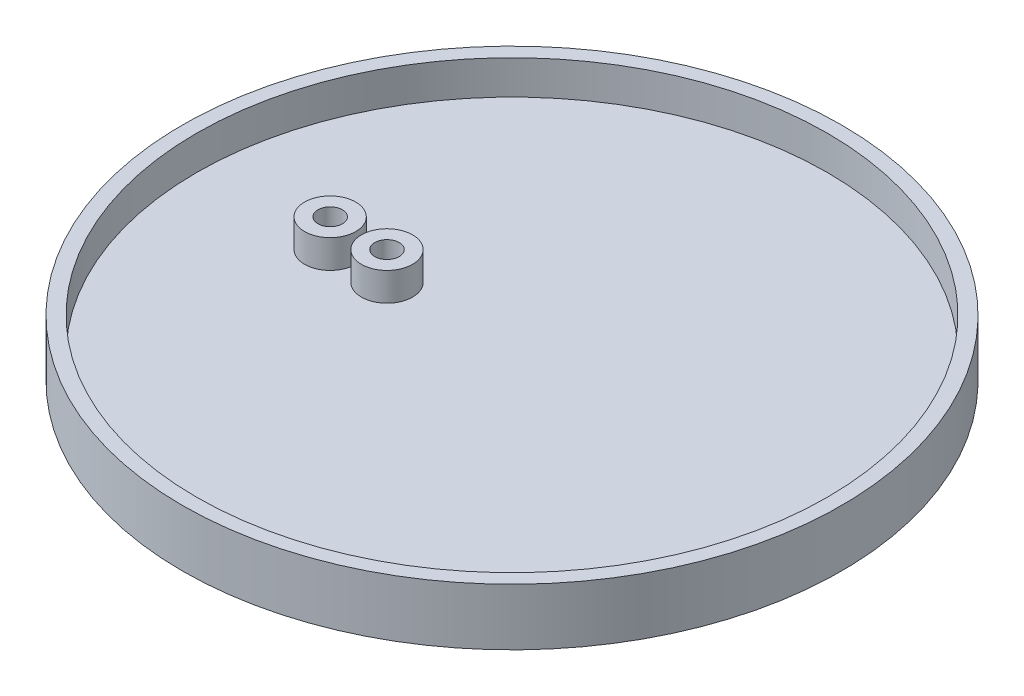
ISO-10303-21;
HEADER;
FILE_DESCRIPTION(('STEP AP214'),'2;1');
FILE_NAME('part.step','',(''),(''),'','','');
FILE_SCHEMA(('AUTOMOTIVE_DESIGN { 1 0 10303 214 1 1 1 1 }'));
ENDSEC;
DATA;
#1=APPLICATION_CONTEXT('core data for automotive mechanical design processes');
#2=APPLICATION_PROTOCOL_DEFINITION('international standard','automotive_design',2000,#1);
#3=PRODUCT_CONTEXT('',#1,'mechanical');
#4=PRODUCT('Part','Part','',(#3));
#5=PRODUCT_RELATED_PRODUCT_CATEGORY('part','',(#4));
#6=PRODUCT_DEFINITION_FORMATION('','',#4);
#7=PRODUCT_DEFINITION_CONTEXT('part definition',#1,'design');
#8=PRODUCT_DEFINITION('design','',#6,#7);
#9=PRODUCT_DEFINITION_SHAPE('','',#8);
#10=(LENGTH_UNIT() NAMED_UNIT(*) SI_UNIT(.MILLI.,.METRE.));
#11=(NAMED_UNIT(*) PLANE_ANGLE_UNIT() SI_UNIT($,.RADIAN.));
#12=(NAMED_UNIT(*) SI_UNIT($,.STERADIAN.) SOLID_ANGLE_UNIT());
#13=UNCERTAINTY_MEASURE_WITH_UNIT(LENGTH_MEASURE(1.E-05),#10,'distance_accuracy_value','');
#14=(GEOMETRIC_REPRESENTATION_CONTEXT(3) GLOBAL_UNCERTAINTY_ASSIGNED_CONTEXT((#13)) GLOBAL_UNIT_ASSIGNED_CONTEXT((#10,
#11,#12)) REPRESENTATION_CONTEXT('',''));
#15=CARTESIAN_POINT('',(0.,0.,0.));
#16=DIRECTION('',(0.,0.,1.));
#17=DIRECTION('',(1.,0.,0.));
#18=AXIS2_PLACEMENT_3D('',#15,#16,#17);
#19=CARTESIAN_POINT('',(0.,4.,0.));
#20=DIRECTION('',(0.,-1.,0.));
#21=DIRECTION('',(0.,0.,-1.));
#22=AXIS2_PLACEMENT_3D('',#19,#20,#21);
#23=CYLINDRICAL_SURFACE('',#22,58.);
#24=CARTESIAN_POINT('',(0.,0.,0.));
#25=DIRECTION('',(0.,1.,0.));
#26=DIRECTION('',(0.,0.,1.));
#27=AXIS2_PLACEMENT_3D('',#24,#25,#26);
#28=CIRCLE('',#27,58.);
#29=CARTESIAN_POINT('',(0.,0.,58.));
#30=VERTEX_POINT('',#29);
#31=EDGE_CURVE('E62',#30,#30,#28,.T.);
#32=ORIENTED_EDGE('',*,*,#31,.T.);
#33=EDGE_LOOP('',(#32));
#34=FACE_BOUND('',#33,.T.);
#35=CARTESIAN_POINT('',(0.,10.,0.));
#36=DIRECTION('',(0.,1.,0.));
#37=DIRECTION('',(0.,0.,1.));
#38=AXIS2_PLACEMENT_3D('',#35,#36,#37);
#39=CIRCLE('',#38,58.);
#40=CARTESIAN_POINT('',(0.,10.,58.));
#41=VERTEX_POINT('',#40);
#42=EDGE_CURVE('E54',#41,#41,#39,.T.);
#43=ORIENTED_EDGE('',*,*,#42,.F.);
#44=EDGE_LOOP('',(#43));
#45=FACE_BOUND('',#44,.T.);
#46=ADVANCED_FACE('F39',(#34,#45),#23,.T.);
#47=CARTESIAN_POINT('',(-22.,0.,0.));
#48=DIRECTION('',(0.,1.,0.));
#49=DIRECTION('',(0.,0.,1.));
#50=AXIS2_PLACEMENT_3D('',#47,#48,#49);
#51=PLANE('',#50);
#52=CARTESIAN_POINT('',(-22.,0.,0.));
#53=DIRECTION('',(0.,1.,0.));
#54=DIRECTION('',(0.,0.,1.));
#55=AXIS2_PLACEMENT_3D('',#52,#53,#54);
#56=CIRCLE('',#55,2.15);
#57=CARTESIAN_POINT('',(-22.,0.,2.15));
#58=VERTEX_POINT('',#57);
#59=EDGE_CURVE('E118',#58,#58,#56,.T.);
#60=ORIENTED_EDGE('',*,*,#59,.T.);
#61=EDGE_LOOP('',(#60));
#62=FACE_BOUND('',#61,.T.);
#63=CARTESIAN_POINT('',(-32.,0.,0.));
#64=DIRECTION('',(0.,1.,0.));
#65=DIRECTION('',(0.,0.,1.));
#66=AXIS2_PLACEMENT_3D('',#63,#64,#65);
#67=CIRCLE('',#66,2.15);
#68=CARTESIAN_POINT('',(-32.,0.,2.15));
#69=VERTEX_POINT('',#68);
#70=EDGE_CURVE('E124',#69,#69,#67,.T.);
#71=ORIENTED_EDGE('',*,*,#70,.T.);
#72=EDGE_LOOP('',(#71));
#73=FACE_BOUND('',#72,.T.);
#74=ORIENTED_EDGE('',*,*,#31,.F.);
#75=EDGE_LOOP('',(#74));
#76=FACE_BOUND('',#75,.T.);
#77=ADVANCED_FACE('F102',(#62,#73,#76),#51,.F.);
#78=CARTESIAN_POINT('',(0.,10.,0.));
#79=DIRECTION('',(0.,1.,0.));
#80=DIRECTION('',(0.,0.,1.));
#81=AXIS2_PLACEMENT_3D('',#78,#79,#80);
#82=PLANE('',#81);
#83=ORIENTED_EDGE('',*,*,#42,.T.);
#84=EDGE_LOOP('',(#83));
#85=FACE_BOUND('',#84,.T.);
#86=CARTESIAN_POINT('',(0.,10.,0.));
#87=DIRECTION('',(0.,1.,0.));
#88=DIRECTION('',(0.,0.,1.));
#89=AXIS2_PLACEMENT_3D('',#86,#87,#88);
#90=CIRCLE('',#89,55.5);
#91=CARTESIAN_POINT('',(0.,10.,55.5));
#92=VERTEX_POINT('',#91);
#93=EDGE_CURVE('E112',#92,#92,#90,.T.);
#94=ORIENTED_EDGE('',*,*,#93,.F.);
#95=EDGE_LOOP('',(#94));
#96=FACE_BOUND('',#95,.T.);
#97=ADVANCED_FACE('F97',(#85,#96),#82,.T.);
#98=CARTESIAN_POINT('',(0.,10.,0.));
#99=DIRECTION('',(0.,-1.,0.));
#100=DIRECTION('',(0.,0.,-1.));
#101=AXIS2_PLACEMENT_3D('',#98,#99,#100);
#102=CYLINDRICAL_SURFACE('',#101,55.5);
#103=CARTESIAN_POINT('',(0.,4.,0.));
#104=DIRECTION('',(0.,1.,0.));
#105=DIRECTION('',(0.,0.,1.));
#106=AXIS2_PLACEMENT_3D('',#103,#104,#105);
#107=CIRCLE('',#106,55.5);
#108=CARTESIAN_POINT('',(0.,4.,55.5));
#109=VERTEX_POINT('',#108);
#110=EDGE_CURVE('E10',#109,#109,#107,.F.);
#111=ORIENTED_EDGE('',*,*,#110,.T.);
#112=EDGE_LOOP('',(#111));
#113=FACE_BOUND('',#112,.T.);
#114=ORIENTED_EDGE('',*,*,#93,.T.);
#115=EDGE_LOOP('',(#114));
#116=FACE_BOUND('',#115,.T.);
#117=ADVANCED_FACE('F88',(#113,#116),#102,.F.);
#118=CARTESIAN_POINT('',(-32.,9.,0.));
#119=DIRECTION('',(0.,1.,0.));
#120=DIRECTION('',(0.,0.,1.));
#121=AXIS2_PLACEMENT_3D('',#118,#119,#120);
#122=PLANE('',#121);
#123=CARTESIAN_POINT('',(-32.,9.,0.));
#124=DIRECTION('',(0.,1.,0.));
#125=DIRECTION('',(0.,0.,1.));
#126=AXIS2_PLACEMENT_3D('',#123,#124,#125);
#127=CIRCLE('',#126,2.15);
#128=CARTESIAN_POINT('',(-32.,9.,2.15));
#129=VERTEX_POINT('',#128);
#130=EDGE_CURVE('E121',#129,#129,#127,.T.);
#131=ORIENTED_EDGE('',*,*,#130,.F.);
#132=EDGE_LOOP('',(#131));
#133=FACE_BOUND('',#132,.T.);
#134=CARTESIAN_POINT('',(-32.,9.,0.));
#135=DIRECTION('',(0.,1.,0.));
#136=DIRECTION('',(0.,0.,1.));
#137=AXIS2_PLACEMENT_3D('',#134,#135,#136);
#138=CIRCLE('',#137,4.5);
#139=CARTESIAN_POINT('',(-32.,9.,4.5));
#140=VERTEX_POINT('',#139);
#141=EDGE_CURVE('E56',#140,#140,#138,.T.);
#142=ORIENTED_EDGE('',*,*,#141,.T.);
#143=EDGE_LOOP('',(#142));
#144=FACE_BOUND('',#143,.T.);
#145=ADVANCED_FACE('F86',(#133,#144),#122,.T.);
#146=CARTESIAN_POINT('',(-22.,9.,0.));
#147=DIRECTION('',(0.,1.,0.));
#148=DIRECTION('',(0.,0.,1.));
#149=AXIS2_PLACEMENT_3D('',#146,#147,#148);
#150=PLANE('',#149);
#151=CARTESIAN_POINT('',(-22.,9.,0.));
#152=DIRECTION('',(0.,1.,0.));
#153=DIRECTION('',(0.,0.,1.));
#154=AXIS2_PLACEMENT_3D('',#151,#152,#153);
#155=CIRCLE('',#154,2.15);
#156=CARTESIAN_POINT('',(-22.,9.,2.15));
#157=VERTEX_POINT('',#156);
#158=EDGE_CURVE('E114',#157,#157,#155,.T.);
#159=ORIENTED_EDGE('',*,*,#158,.F.);
#160=EDGE_LOOP('',(#159));
#161=FACE_BOUND('',#160,.T.);
#162=CARTESIAN_POINT('',(-22.,9.,0.));
#163=DIRECTION('',(0.,1.,0.));
#164=DIRECTION('',(0.,0.,1.));
#165=AXIS2_PLACEMENT_3D('',#162,#163,#164);
#166=CIRCLE('',#165,4.5);
#167=CARTESIAN_POINT('',(-22.,9.,4.5));
#168=VERTEX_POINT('',#167);
#169=EDGE_CURVE('E47',#168,#168,#166,.T.);
#170=ORIENTED_EDGE('',*,*,#169,.T.);
#171=EDGE_LOOP('',(#170));
#172=FACE_BOUND('',#171,.T.);
#173=ADVANCED_FACE('F82',(#161,#172),#150,.T.);
#174=CARTESIAN_POINT('',(-32.,9.,0.));
#175=DIRECTION('',(0.,-1.,0.));
#176=DIRECTION('',(0.,0.,-1.));
#177=AXIS2_PLACEMENT_3D('',#174,#175,#176);
#178=CYLINDRICAL_SURFACE('',#177,4.5);
#179=CARTESIAN_POINT('',(-32.,4.,0.));
#180=DIRECTION('',(0.,1.,0.));
#181=DIRECTION('',(0.,0.,1.));
#182=AXIS2_PLACEMENT_3D('',#179,#180,#181);
#183=CIRCLE('',#182,4.5);
#184=CARTESIAN_POINT('',(-32.,4.,4.5));
#185=VERTEX_POINT('',#184);
#186=EDGE_CURVE('E59',#185,#185,#183,.F.);
#187=ORIENTED_EDGE('',*,*,#186,.F.);
#188=EDGE_LOOP('',(#187));
#189=FACE_BOUND('',#188,.T.);
#190=ORIENTED_EDGE('',*,*,#141,.F.);
#191=EDGE_LOOP('',(#190));
#192=FACE_BOUND('',#191,.T.);
#193=ADVANCED_FACE('F79',(#189,#192),#178,.T.);
#194=CARTESIAN_POINT('',(-22.,9.,0.));
#195=DIRECTION('',(0.,-1.,0.));
#196=DIRECTION('',(0.,0.,-1.));
#197=AXIS2_PLACEMENT_3D('',#194,#195,#196);
#198=CYLINDRICAL_SURFACE('',#197,4.5);
#199=CARTESIAN_POINT('',(-22.,4.,0.));
#200=DIRECTION('',(0.,1.,0.));
#201=DIRECTION('',(0.,0.,1.));
#202=AXIS2_PLACEMENT_3D('',#199,#200,#201);
#203=CIRCLE('',#202,4.5);
#204=CARTESIAN_POINT('',(-22.,4.,4.5));
#205=VERTEX_POINT('',#204);
#206=EDGE_CURVE('E43',#205,#205,#203,.T.);
#207=ORIENTED_EDGE('',*,*,#206,.T.);
#208=EDGE_LOOP('',(#207));
#209=FACE_BOUND('',#208,.T.);
#210=ORIENTED_EDGE('',*,*,#169,.F.);
#211=EDGE_LOOP('',(#210));
#212=FACE_BOUND('',#211,.T.);
#213=ADVANCED_FACE('F41',(#209,#212),#198,.T.);
#214=CARTESIAN_POINT('',(0.,4.,0.));
#215=DIRECTION('',(0.,1.,0.));
#216=DIRECTION('',(0.,0.,1.));
#217=AXIS2_PLACEMENT_3D('',#214,#215,#216);
#218=PLANE('',#217);
#219=ORIENTED_EDGE('',*,*,#206,.F.);
#220=EDGE_LOOP('',(#219));
#221=FACE_BOUND('',#220,.T.);
#222=ORIENTED_EDGE('',*,*,#186,.T.);
#223=EDGE_LOOP('',(#222));
#224=FACE_BOUND('',#223,.T.);
#225=ORIENTED_EDGE('',*,*,#110,.F.);
#226=EDGE_LOOP('',(#225));
#227=FACE_BOUND('',#226,.T.);
#228=ADVANCED_FACE('F71',(#221,#224,#227),#218,.T.);
#229=CARTESIAN_POINT('',(-22.,9.,0.));
#230=DIRECTION('',(0.,-1.,0.));
#231=DIRECTION('',(0.,0.,-1.));
#232=AXIS2_PLACEMENT_3D('',#229,#230,#231);
#233=CYLINDRICAL_SURFACE('',#232,2.15);
#234=ORIENTED_EDGE('',*,*,#158,.T.);
#235=EDGE_LOOP('',(#234));
#236=FACE_BOUND('',#235,.T.);
#237=ORIENTED_EDGE('',*,*,#59,.F.);
#238=EDGE_LOOP('',(#237));
#239=FACE_BOUND('',#238,.T.);
#240=ADVANCED_FACE('F74',(#236,#239),#233,.F.);
#241=CARTESIAN_POINT('',(-32.,9.,0.));
#242=DIRECTION('',(0.,-1.,0.));
#243=DIRECTION('',(0.,0.,-1.));
#244=AXIS2_PLACEMENT_3D('',#241,#242,#243);
#245=CYLINDRICAL_SURFACE('',#244,2.15);
#246=ORIENTED_EDGE('',*,*,#130,.T.);
#247=EDGE_LOOP('',(#246));
#248=FACE_BOUND('',#247,.T.);
#249=ORIENTED_EDGE('',*,*,#70,.F.);
#250=EDGE_LOOP('',(#249));
#251=FACE_BOUND('',#250,.T.);
#252=ADVANCED_FACE('F132',(#248,#251),#245,.F.);
#253=CLOSED_SHELL('',(#46,#77,#97,#117,#145,#173,#193,#213,#228,#240,#252));
#254=MANIFOLD_SOLID_BREP('B2',#253);
#255=ADVANCED_BREP_SHAPE_REPRESENTATION('',(#18,#254),#14);
#256=SHAPE_DEFINITION_REPRESENTATION(#9,#255);
ENDSEC;
END-ISO-10303-21;
